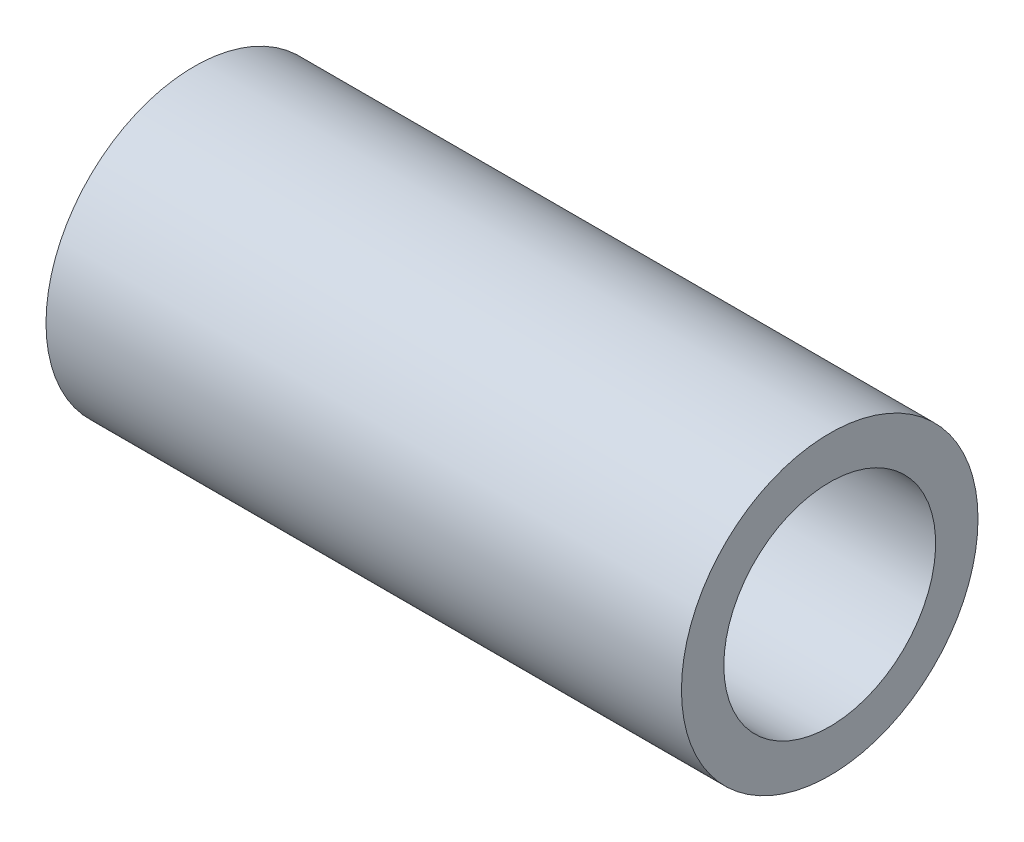
ISO-10303-21;
HEADER;
FILE_DESCRIPTION(('STEP AP214'),'2;1');
FILE_NAME('part.step','',(''),(''),'','','');
FILE_SCHEMA(('AUTOMOTIVE_DESIGN { 1 0 10303 214 1 1 1 1 }'));
ENDSEC;
DATA;
#1=APPLICATION_CONTEXT('core data for automotive mechanical design processes');
#2=APPLICATION_PROTOCOL_DEFINITION('international standard','automotive_design',2000,#1);
#3=PRODUCT_CONTEXT('',#1,'mechanical');
#4=PRODUCT('Part','Part','',(#3));
#5=PRODUCT_RELATED_PRODUCT_CATEGORY('part','',(#4));
#6=PRODUCT_DEFINITION_FORMATION('','',#4);
#7=PRODUCT_DEFINITION_CONTEXT('part definition',#1,'design');
#8=PRODUCT_DEFINITION('design','',#6,#7);
#9=PRODUCT_DEFINITION_SHAPE('','',#8);
#10=(LENGTH_UNIT() NAMED_UNIT(*) SI_UNIT(.MILLI.,.METRE.));
#11=(NAMED_UNIT(*) PLANE_ANGLE_UNIT() SI_UNIT($,.RADIAN.));
#12=(NAMED_UNIT(*) SI_UNIT($,.STERADIAN.) SOLID_ANGLE_UNIT());
#13=UNCERTAINTY_MEASURE_WITH_UNIT(LENGTH_MEASURE(1.E-05),#10,'distance_accuracy_value','');
#14=(GEOMETRIC_REPRESENTATION_CONTEXT(3) GLOBAL_UNCERTAINTY_ASSIGNED_CONTEXT((#13)) GLOBAL_UNIT_ASSIGNED_CONTEXT((#10,
#11,#12)) REPRESENTATION_CONTEXT('',''));
#15=CARTESIAN_POINT('',(0.,0.,0.));
#16=DIRECTION('',(0.,0.,1.));
#17=DIRECTION('',(1.,0.,0.));
#18=AXIS2_PLACEMENT_3D('',#15,#16,#17);
#19=CARTESIAN_POINT('',(0.,7.,0.));
#20=DIRECTION('',(1.,0.,0.));
#21=DIRECTION('',(0.,0.,-1.));
#22=AXIS2_PLACEMENT_3D('',#19,#20,#21);
#23=PLANE('',#22);
#24=CARTESIAN_POINT('',(0.,0.,0.));
#25=DIRECTION('',(-1.,0.,0.));
#26=DIRECTION('',(0.,0.,1.));
#27=AXIS2_PLACEMENT_3D('',#24,#25,#26);
#28=CIRCLE('',#27,5.);
#29=CARTESIAN_POINT('',(0.,0.,5.));
#30=VERTEX_POINT('',#29);
#31=EDGE_CURVE('E10',#30,#30,#28,.T.);
#32=ORIENTED_EDGE('',*,*,#31,.F.);
#33=EDGE_LOOP('',(#32));
#34=FACE_BOUND('',#33,.T.);
#35=CARTESIAN_POINT('',(0.,0.,0.));
#36=DIRECTION('',(-1.,0.,0.));
#37=DIRECTION('',(0.,0.,1.));
#38=AXIS2_PLACEMENT_3D('',#35,#36,#37);
#39=CIRCLE('',#38,7.);
#40=CARTESIAN_POINT('',(0.,0.,7.));
#41=VERTEX_POINT('',#40);
#42=EDGE_CURVE('E45',#41,#41,#39,.T.);
#43=ORIENTED_EDGE('',*,*,#42,.T.);
#44=EDGE_LOOP('',(#43));
#45=FACE_BOUND('',#44,.T.);
#46=ADVANCED_FACE('F31',(#34,#45),#23,.F.);
#47=CARTESIAN_POINT('',(0.,0.,0.));
#48=DIRECTION('',(-1.,0.,0.));
#49=DIRECTION('',(0.,0.,1.));
#50=AXIS2_PLACEMENT_3D('',#47,#48,#49);
#51=CYLINDRICAL_SURFACE('',#50,5.);
#52=CARTESIAN_POINT('',(30.,0.,0.));
#53=DIRECTION('',(-1.,0.,0.));
#54=DIRECTION('',(0.,0.,1.));
#55=AXIS2_PLACEMENT_3D('',#52,#53,#54);
#56=CIRCLE('',#55,5.);
#57=CARTESIAN_POINT('',(30.,0.,5.));
#58=VERTEX_POINT('',#57);
#59=EDGE_CURVE('E37',#58,#58,#56,.T.);
#60=ORIENTED_EDGE('',*,*,#59,.F.);
#61=EDGE_LOOP('',(#60));
#62=FACE_BOUND('',#61,.T.);
#63=ORIENTED_EDGE('',*,*,#31,.T.);
#64=EDGE_LOOP('',(#63));
#65=FACE_BOUND('',#64,.T.);
#66=ADVANCED_FACE('F60',(#62,#65),#51,.F.);
#67=CARTESIAN_POINT('',(30.,7.,0.));
#68=DIRECTION('',(-1.,0.,0.));
#69=DIRECTION('',(0.,0.,1.));
#70=AXIS2_PLACEMENT_3D('',#67,#68,#69);
#71=PLANE('',#70);
#72=CARTESIAN_POINT('',(30.,0.,0.));
#73=DIRECTION('',(-1.,0.,0.));
#74=DIRECTION('',(0.,0.,1.));
#75=AXIS2_PLACEMENT_3D('',#72,#73,#74);
#76=CIRCLE('',#75,7.);
#77=CARTESIAN_POINT('',(30.,0.,7.));
#78=VERTEX_POINT('',#77);
#79=EDGE_CURVE('E41',#78,#78,#76,.T.);
#80=ORIENTED_EDGE('',*,*,#79,.F.);
#81=EDGE_LOOP('',(#80));
#82=FACE_BOUND('',#81,.T.);
#83=ORIENTED_EDGE('',*,*,#59,.T.);
#84=EDGE_LOOP('',(#83));
#85=FACE_BOUND('',#84,.T.);
#86=ADVANCED_FACE('F55',(#82,#85),#71,.F.);
#87=CARTESIAN_POINT('',(0.,0.,0.));
#88=DIRECTION('',(-1.,0.,0.));
#89=DIRECTION('',(0.,0.,1.));
#90=AXIS2_PLACEMENT_3D('',#87,#88,#89);
#91=CYLINDRICAL_SURFACE('',#90,7.);
#92=ORIENTED_EDGE('',*,*,#42,.F.);
#93=EDGE_LOOP('',(#92));
#94=FACE_BOUND('',#93,.T.);
#95=ORIENTED_EDGE('',*,*,#79,.T.);
#96=EDGE_LOOP('',(#95));
#97=FACE_BOUND('',#96,.T.);
#98=ADVANCED_FACE('F52',(#94,#97),#91,.T.);
#99=CLOSED_SHELL('',(#46,#66,#86,#98));
#100=MANIFOLD_SOLID_BREP('B2',#99);
#101=ADVANCED_BREP_SHAPE_REPRESENTATION('',(#18,#100),#14);
#102=SHAPE_DEFINITION_REPRESENTATION(#9,#101);
ENDSEC;
END-ISO-10303-21;
